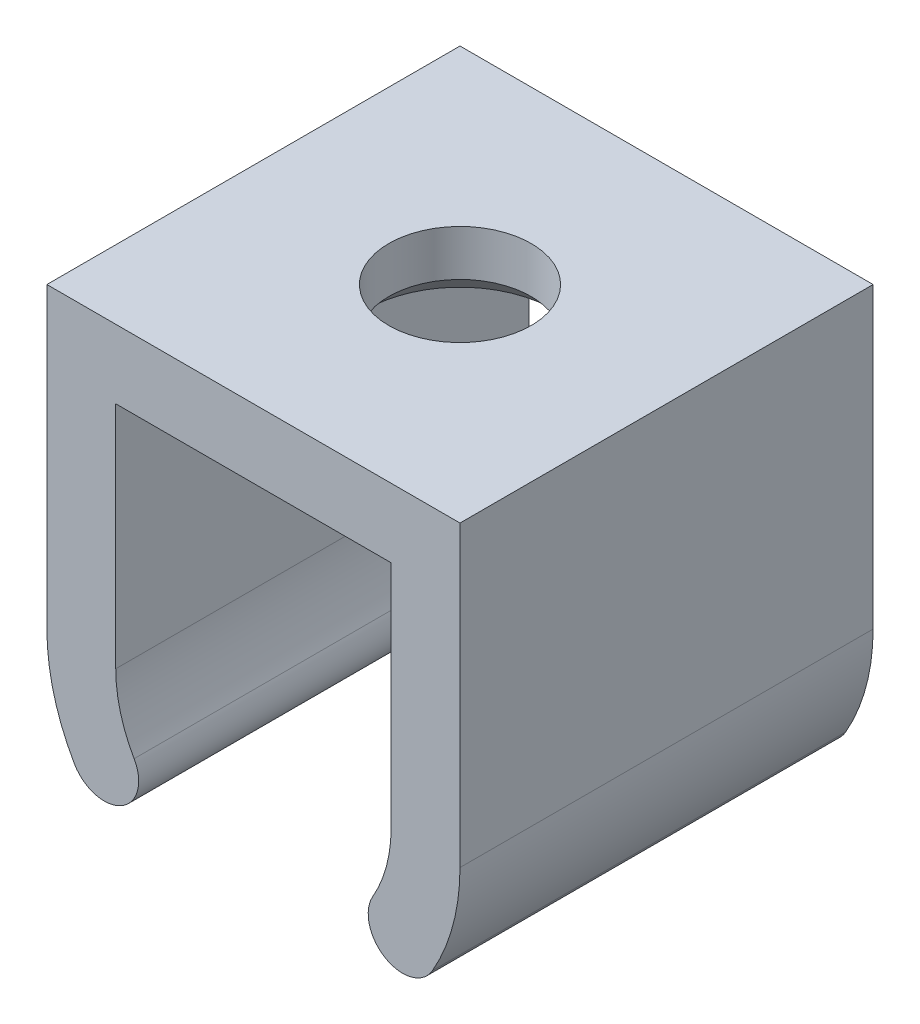
ISO-10303-21;
HEADER;
FILE_DESCRIPTION(('STEP AP214'),'2;1');
FILE_NAME('part.step','',(''),(''),'','','');
FILE_SCHEMA(('AUTOMOTIVE_DESIGN { 1 0 10303 214 1 1 1 1 }'));
ENDSEC;
DATA;
#1=APPLICATION_CONTEXT('core data for automotive mechanical design processes');
#2=APPLICATION_PROTOCOL_DEFINITION('international standard','automotive_design',2000,#1);
#3=PRODUCT_CONTEXT('',#1,'mechanical');
#4=PRODUCT('Part','Part','',(#3));
#5=PRODUCT_RELATED_PRODUCT_CATEGORY('part','',(#4));
#6=PRODUCT_DEFINITION_FORMATION('','',#4);
#7=PRODUCT_DEFINITION_CONTEXT('part definition',#1,'design');
#8=PRODUCT_DEFINITION('design','',#6,#7);
#9=PRODUCT_DEFINITION_SHAPE('','',#8);
#10=(LENGTH_UNIT() NAMED_UNIT(*) SI_UNIT(.MILLI.,.METRE.));
#11=(NAMED_UNIT(*) PLANE_ANGLE_UNIT() SI_UNIT($,.RADIAN.));
#12=(NAMED_UNIT(*) SI_UNIT($,.STERADIAN.) SOLID_ANGLE_UNIT());
#13=UNCERTAINTY_MEASURE_WITH_UNIT(LENGTH_MEASURE(1.E-05),#10,'distance_accuracy_value','');
#14=(GEOMETRIC_REPRESENTATION_CONTEXT(3) GLOBAL_UNCERTAINTY_ASSIGNED_CONTEXT((#13)) GLOBAL_UNIT_ASSIGNED_CONTEXT((#10,
#11,#12)) REPRESENTATION_CONTEXT('',''));
#15=CARTESIAN_POINT('',(0.,0.,0.));
#16=DIRECTION('',(0.,0.,1.));
#17=DIRECTION('',(1.,0.,0.));
#18=AXIS2_PLACEMENT_3D('',#15,#16,#17);
#19=CARTESIAN_POINT('',(0.,0.,4.5));
#20=DIRECTION('',(0.,0.,-1.));
#21=DIRECTION('',(-1.,0.,0.));
#22=AXIS2_PLACEMENT_3D('',#19,#20,#21);
#23=CYLINDRICAL_SURFACE('',#22,3.);
#24=DIRECTION('',(0.,0.,1.));
#25=VECTOR('',#24,1.);
#26=CARTESIAN_POINT('',(3.,0.,-4.5));
#27=LINE('',#26,#25);
#28=CARTESIAN_POINT('',(3.,0.,-4.5));
#29=VERTEX_POINT('',#28);
#30=CARTESIAN_POINT('',(3.,0.,4.500006));
#31=VERTEX_POINT('',#30);
#32=EDGE_CURVE('E209',#29,#31,#27,.T.);
#33=ORIENTED_EDGE('',*,*,#32,.F.);
#34=CARTESIAN_POINT('',(0.,0.,-4.5));
#35=DIRECTION('',(0.,0.,-1.));
#36=DIRECTION('',(1.,0.,0.));
#37=AXIS2_PLACEMENT_3D('',#34,#35,#36);
#38=CIRCLE('',#37,3.);
#39=CARTESIAN_POINT('',(2.6,-1.49666295470958,-4.5));
#40=VERTEX_POINT('',#39);
#41=EDGE_CURVE('E152',#29,#40,#38,.T.);
#42=ORIENTED_EDGE('',*,*,#41,.T.);
#43=DIRECTION('',(0.,0.,-1.));
#44=VECTOR('',#43,1.);
#45=CARTESIAN_POINT('',(2.6,-1.49666295470958,4.5));
#46=LINE('',#45,#44);
#47=CARTESIAN_POINT('',(2.6,-1.49666295470958,4.5));
#48=VERTEX_POINT('',#47);
#49=EDGE_CURVE('E166',#48,#40,#46,.T.);
#50=ORIENTED_EDGE('',*,*,#49,.F.);
#51=CARTESIAN_POINT('',(0.,0.,4.5));
#52=DIRECTION('',(0.,0.,-1.));
#53=DIRECTION('',(1.,0.,0.));
#54=AXIS2_PLACEMENT_3D('',#51,#52,#53);
#55=CIRCLE('',#54,3.);
#56=EDGE_CURVE('E180',#31,#48,#55,.T.);
#57=ORIENTED_EDGE('',*,*,#56,.F.);
#58=EDGE_LOOP('',(#33,#42,#50,#57));
#59=FACE_BOUND('',#58,.T.);
#60=ADVANCED_FACE('F33',(#59),#23,.F.);
#61=CARTESIAN_POINT('',(-4.5,0.,4.5));
#62=DIRECTION('',(1.,0.,0.));
#63=DIRECTION('',(0.,0.,-1.));
#64=AXIS2_PLACEMENT_3D('',#61,#62,#63);
#65=PLANE('',#64);
#66=DIRECTION('',(0.,-1.,0.));
#67=VECTOR('',#66,1.);
#68=CARTESIAN_POINT('',(-4.5,0.,-4.5));
#69=LINE('',#68,#67);
#70=CARTESIAN_POINT('',(-4.5,6.5,-4.5));
#71=VERTEX_POINT('',#70);
#72=CARTESIAN_POINT('',(-4.5,0.,-4.5));
#73=VERTEX_POINT('',#72);
#74=EDGE_CURVE('E144',#71,#73,#69,.T.);
#75=ORIENTED_EDGE('',*,*,#74,.T.);
#76=DIRECTION('',(0.,0.,-1.));
#77=VECTOR('',#76,1.);
#78=CARTESIAN_POINT('',(-4.5,0.,4.5));
#79=LINE('',#78,#77);
#80=CARTESIAN_POINT('',(-4.5,0.,4.5));
#81=VERTEX_POINT('',#80);
#82=EDGE_CURVE('E175',#81,#73,#79,.T.);
#83=ORIENTED_EDGE('',*,*,#82,.F.);
#84=DIRECTION('',(0.,-1.,0.));
#85=VECTOR('',#84,1.);
#86=CARTESIAN_POINT('',(-4.5,0.,4.5));
#87=LINE('',#86,#85);
#88=CARTESIAN_POINT('',(-4.5,6.5,4.5));
#89=VERTEX_POINT('',#88);
#90=EDGE_CURVE('E162',#89,#81,#87,.T.);
#91=ORIENTED_EDGE('',*,*,#90,.F.);
#92=DIRECTION('',(0.,0.,-1.));
#93=VECTOR('',#92,1.);
#94=CARTESIAN_POINT('',(-4.5,6.5,4.5));
#95=LINE('',#94,#93);
#96=EDGE_CURVE('E140',#89,#71,#95,.T.);
#97=ORIENTED_EDGE('',*,*,#96,.T.);
#98=EDGE_LOOP('',(#75,#83,#91,#97));
#99=FACE_BOUND('',#98,.T.);
#100=ADVANCED_FACE('F266',(#99),#65,.F.);
#101=CARTESIAN_POINT('',(0.,0.,4.5));
#102=DIRECTION('',(0.,0.,-1.));
#103=DIRECTION('',(-1.,0.,0.));
#104=AXIS2_PLACEMENT_3D('',#101,#102,#103);
#105=CYLINDRICAL_SURFACE('',#104,4.5);
#106=CARTESIAN_POINT('',(0.,0.,-4.5));
#107=DIRECTION('',(0.,0.,1.));
#108=DIRECTION('',(-1.,0.,0.));
#109=AXIS2_PLACEMENT_3D('',#106,#107,#108);
#110=CIRCLE('',#109,4.5);
#111=CARTESIAN_POINT('',(-3.9,-2.24499443206436,-4.5));
#112=VERTEX_POINT('',#111);
#113=EDGE_CURVE('E147',#73,#112,#110,.T.);
#114=ORIENTED_EDGE('',*,*,#113,.T.);
#115=DIRECTION('',(0.,0.,-1.));
#116=VECTOR('',#115,1.);
#117=CARTESIAN_POINT('',(-3.9,-2.24499443206436,4.5));
#118=LINE('',#117,#116);
#119=CARTESIAN_POINT('',(-3.9,-2.24499443206436,4.5));
#120=VERTEX_POINT('',#119);
#121=EDGE_CURVE('E172',#120,#112,#118,.T.);
#122=ORIENTED_EDGE('',*,*,#121,.F.);
#123=CARTESIAN_POINT('',(0.,0.,4.5));
#124=DIRECTION('',(0.,0.,1.));
#125=DIRECTION('',(-1.,0.,0.));
#126=AXIS2_PLACEMENT_3D('',#123,#124,#125);
#127=CIRCLE('',#126,4.5);
#128=EDGE_CURVE('E99',#81,#120,#127,.T.);
#129=ORIENTED_EDGE('',*,*,#128,.F.);
#130=ORIENTED_EDGE('',*,*,#82,.T.);
#131=EDGE_LOOP('',(#114,#122,#129,#130));
#132=FACE_BOUND('',#131,.T.);
#133=ADVANCED_FACE('F262',(#132),#105,.T.);
#134=CARTESIAN_POINT('',(-3.25,-1.87082869338697,4.5));
#135=DIRECTION('',(0.,0.,-1.));
#136=DIRECTION('',(-1.,0.,0.));
#137=AXIS2_PLACEMENT_3D('',#134,#135,#136);
#138=CYLINDRICAL_SURFACE('',#137,0.75);
#139=CARTESIAN_POINT('',(-3.25,-1.87082869338697,-4.5));
#140=DIRECTION('',(0.,0.,1.));
#141=DIRECTION('',(1.,0.,0.));
#142=AXIS2_PLACEMENT_3D('',#139,#140,#141);
#143=CIRCLE('',#142,0.75);
#144=CARTESIAN_POINT('',(-2.6,-1.49666295470958,-4.5));
#145=VERTEX_POINT('',#144);
#146=EDGE_CURVE('E150',#112,#145,#143,.T.);
#147=ORIENTED_EDGE('',*,*,#146,.T.);
#148=DIRECTION('',(0.,0.,-1.));
#149=VECTOR('',#148,1.);
#150=CARTESIAN_POINT('',(-2.6,-1.49666295470958,4.5));
#151=LINE('',#150,#149);
#152=CARTESIAN_POINT('',(-2.6,-1.49666295470958,4.5));
#153=VERTEX_POINT('',#152);
#154=EDGE_CURVE('E169',#153,#145,#151,.T.);
#155=ORIENTED_EDGE('',*,*,#154,.F.);
#156=CARTESIAN_POINT('',(-3.25,-1.87082869338697,4.5));
#157=DIRECTION('',(0.,0.,1.));
#158=DIRECTION('',(1.,0.,0.));
#159=AXIS2_PLACEMENT_3D('',#156,#157,#158);
#160=CIRCLE('',#159,0.75);
#161=EDGE_CURVE('E183',#120,#153,#160,.T.);
#162=ORIENTED_EDGE('',*,*,#161,.F.);
#163=ORIENTED_EDGE('',*,*,#121,.T.);
#164=EDGE_LOOP('',(#147,#155,#162,#163));
#165=FACE_BOUND('',#164,.T.);
#166=ADVANCED_FACE('F261',(#165),#138,.T.);
#167=CARTESIAN_POINT('',(-3.,0.,-4.5));
#168=VERTEX_POINT('',#167);
#169=EDGE_CURVE('E153',#145,#168,#38,.T.);
#170=ORIENTED_EDGE('',*,*,#169,.T.);
#171=DIRECTION('',(0.,0.,1.));
#172=VECTOR('',#171,1.);
#173=CARTESIAN_POINT('',(-3.,0.,-4.5));
#174=LINE('',#173,#172);
#175=CARTESIAN_POINT('',(-3.,0.,4.500006));
#176=VERTEX_POINT('',#175);
#177=EDGE_CURVE('E198',#168,#176,#174,.T.);
#178=ORIENTED_EDGE('',*,*,#177,.T.);
#179=EDGE_CURVE('E177',#153,#176,#55,.T.);
#180=ORIENTED_EDGE('',*,*,#179,.F.);
#181=ORIENTED_EDGE('',*,*,#154,.T.);
#182=EDGE_LOOP('',(#170,#178,#180,#181));
#183=FACE_BOUND('',#182,.T.);
#184=ADVANCED_FACE('F255',(#183),#23,.F.);
#185=CARTESIAN_POINT('',(3.25,-1.87082869338697,4.5));
#186=DIRECTION('',(0.,0.,-1.));
#187=DIRECTION('',(-1.,0.,0.));
#188=AXIS2_PLACEMENT_3D('',#185,#186,#187);
#189=CYLINDRICAL_SURFACE('',#188,0.75);
#190=CARTESIAN_POINT('',(3.25,-1.87082869338697,-4.5));
#191=DIRECTION('',(0.,0.,1.));
#192=DIRECTION('',(1.,0.,0.));
#193=AXIS2_PLACEMENT_3D('',#190,#191,#192);
#194=CIRCLE('',#193,0.75);
#195=CARTESIAN_POINT('',(3.9,-2.24499443206436,-4.5));
#196=VERTEX_POINT('',#195);
#197=EDGE_CURVE('E156',#40,#196,#194,.T.);
#198=ORIENTED_EDGE('',*,*,#197,.T.);
#199=DIRECTION('',(0.,0.,-1.));
#200=VECTOR('',#199,1.);
#201=CARTESIAN_POINT('',(3.9,-2.24499443206436,4.5));
#202=LINE('',#201,#200);
#203=CARTESIAN_POINT('',(3.9,-2.24499443206436,4.5));
#204=VERTEX_POINT('',#203);
#205=EDGE_CURVE('E135',#204,#196,#202,.T.);
#206=ORIENTED_EDGE('',*,*,#205,.F.);
#207=CARTESIAN_POINT('',(3.25,-1.87082869338697,4.5));
#208=DIRECTION('',(0.,0.,1.));
#209=DIRECTION('',(1.,0.,0.));
#210=AXIS2_PLACEMENT_3D('',#207,#208,#209);
#211=CIRCLE('',#210,0.75);
#212=EDGE_CURVE('E123',#48,#204,#211,.T.);
#213=ORIENTED_EDGE('',*,*,#212,.F.);
#214=ORIENTED_EDGE('',*,*,#49,.T.);
#215=EDGE_LOOP('',(#198,#206,#213,#214));
#216=FACE_BOUND('',#215,.T.);
#217=ADVANCED_FACE('F287',(#216),#189,.T.);
#218=CARTESIAN_POINT('',(0.,0.,4.5));
#219=DIRECTION('',(0.,0.,-1.));
#220=DIRECTION('',(-1.,0.,0.));
#221=AXIS2_PLACEMENT_3D('',#218,#219,#220);
#222=CYLINDRICAL_SURFACE('',#221,4.5);
#223=CARTESIAN_POINT('',(0.,0.,-4.5));
#224=DIRECTION('',(0.,0.,1.));
#225=DIRECTION('',(-1.,0.,0.));
#226=AXIS2_PLACEMENT_3D('',#223,#224,#225);
#227=CIRCLE('',#226,4.5);
#228=CARTESIAN_POINT('',(4.5,0.,-4.5));
#229=VERTEX_POINT('',#228);
#230=EDGE_CURVE('E132',#196,#229,#227,.T.);
#231=ORIENTED_EDGE('',*,*,#230,.T.);
#232=DIRECTION('',(0.,0.,-1.));
#233=VECTOR('',#232,1.);
#234=CARTESIAN_POINT('',(4.5,0.,4.5));
#235=LINE('',#234,#233);
#236=CARTESIAN_POINT('',(4.5,0.,4.5));
#237=VERTEX_POINT('',#236);
#238=EDGE_CURVE('E129',#237,#229,#235,.T.);
#239=ORIENTED_EDGE('',*,*,#238,.F.);
#240=CARTESIAN_POINT('',(0.,0.,4.5));
#241=DIRECTION('',(0.,0.,1.));
#242=DIRECTION('',(-1.,0.,0.));
#243=AXIS2_PLACEMENT_3D('',#240,#241,#242);
#244=CIRCLE('',#243,4.5);
#245=EDGE_CURVE('E115',#204,#237,#244,.T.);
#246=ORIENTED_EDGE('',*,*,#245,.F.);
#247=ORIENTED_EDGE('',*,*,#205,.T.);
#248=EDGE_LOOP('',(#231,#239,#246,#247));
#249=FACE_BOUND('',#248,.T.);
#250=ADVANCED_FACE('F130',(#249),#222,.T.);
#251=CARTESIAN_POINT('',(4.5,6.5,4.5));
#252=DIRECTION('',(-1.,0.,0.));
#253=DIRECTION('',(0.,0.,1.));
#254=AXIS2_PLACEMENT_3D('',#251,#252,#253);
#255=PLANE('',#254);
#256=DIRECTION('',(0.,1.,0.));
#257=VECTOR('',#256,1.);
#258=CARTESIAN_POINT('',(4.5,6.5,-4.5));
#259=LINE('',#258,#257);
#260=CARTESIAN_POINT('',(4.5,6.5,-4.5));
#261=VERTEX_POINT('',#260);
#262=EDGE_CURVE('E159',#229,#261,#259,.T.);
#263=ORIENTED_EDGE('',*,*,#262,.T.);
#264=DIRECTION('',(0.,0.,-1.));
#265=VECTOR('',#264,1.);
#266=CARTESIAN_POINT('',(4.5,6.5,4.5));
#267=LINE('',#266,#265);
#268=CARTESIAN_POINT('',(4.5,6.5,4.5));
#269=VERTEX_POINT('',#268);
#270=EDGE_CURVE('E136',#269,#261,#267,.T.);
#271=ORIENTED_EDGE('',*,*,#270,.F.);
#272=DIRECTION('',(0.,1.,0.));
#273=VECTOR('',#272,1.);
#274=CARTESIAN_POINT('',(4.5,6.5,4.5));
#275=LINE('',#274,#273);
#276=EDGE_CURVE('E120',#237,#269,#275,.T.);
#277=ORIENTED_EDGE('',*,*,#276,.F.);
#278=ORIENTED_EDGE('',*,*,#238,.T.);
#279=EDGE_LOOP('',(#263,#271,#277,#278));
#280=FACE_BOUND('',#279,.T.);
#281=ADVANCED_FACE('F138',(#280),#255,.F.);
#282=CARTESIAN_POINT('',(-4.5,6.5,4.5));
#283=DIRECTION('',(0.,-1.,0.));
#284=DIRECTION('',(0.,0.,-1.));
#285=AXIS2_PLACEMENT_3D('',#282,#283,#284);
#286=PLANE('',#285);
#287=CARTESIAN_POINT('',(0.,6.5,0.));
#288=DIRECTION('',(0.,1.,0.));
#289=DIRECTION('',(0.,0.,1.));
#290=AXIS2_PLACEMENT_3D('',#287,#288,#289);
#291=CIRCLE('',#290,1.55);
#292=CARTESIAN_POINT('',(0.,6.5,1.55));
#293=VERTEX_POINT('',#292);
#294=EDGE_CURVE('E148',#293,#293,#291,.T.);
#295=ORIENTED_EDGE('',*,*,#294,.F.);
#296=EDGE_LOOP('',(#295));
#297=FACE_BOUND('',#296,.T.);
#298=DIRECTION('',(-1.,0.,0.));
#299=VECTOR('',#298,1.);
#300=CARTESIAN_POINT('',(-4.5,6.5,-4.5));
#301=LINE('',#300,#299);
#302=EDGE_CURVE('E90',#261,#71,#301,.T.);
#303=ORIENTED_EDGE('',*,*,#302,.T.);
#304=ORIENTED_EDGE('',*,*,#96,.F.);
#305=DIRECTION('',(-1.,0.,0.));
#306=VECTOR('',#305,1.);
#307=CARTESIAN_POINT('',(-4.5,6.5,4.5));
#308=LINE('',#307,#306);
#309=EDGE_CURVE('E57',#269,#89,#308,.T.);
#310=ORIENTED_EDGE('',*,*,#309,.F.);
#311=ORIENTED_EDGE('',*,*,#270,.T.);
#312=EDGE_LOOP('',(#303,#304,#310,#311));
#313=FACE_BOUND('',#312,.T.);
#314=ADVANCED_FACE('F267',(#297,#313),#286,.F.);
#315=CARTESIAN_POINT('',(0.,0.,4.5));
#316=DIRECTION('',(0.,0.,-1.));
#317=DIRECTION('',(-1.,0.,0.));
#318=AXIS2_PLACEMENT_3D('',#315,#316,#317);
#319=PLANE('',#318);
#320=ORIENTED_EDGE('',*,*,#179,.T.);
#321=DIRECTION('',(0.,1.,0.));
#322=VECTOR('',#321,1.);
#323=CARTESIAN_POINT('',(-3.,0.,4.5));
#324=LINE('',#323,#322);
#325=CARTESIAN_POINT('',(-3.,5.,4.5));
#326=VERTEX_POINT('',#325);
#327=EDGE_CURVE('E190',#176,#326,#324,.T.);
#328=ORIENTED_EDGE('',*,*,#327,.T.);
#329=DIRECTION('',(1.,0.,0.));
#330=VECTOR('',#329,1.);
#331=CARTESIAN_POINT('',(0.,5.,4.5));
#332=LINE('',#331,#330);
#333=CARTESIAN_POINT('',(3.,5.,4.5));
#334=VERTEX_POINT('',#333);
#335=EDGE_CURVE('E201',#326,#334,#332,.T.);
#336=ORIENTED_EDGE('',*,*,#335,.T.);
#337=DIRECTION('',(0.,-1.,0.));
#338=VECTOR('',#337,1.);
#339=CARTESIAN_POINT('',(3.,0.,4.5));
#340=LINE('',#339,#338);
#341=EDGE_CURVE('E195',#334,#31,#340,.T.);
#342=ORIENTED_EDGE('',*,*,#341,.T.);
#343=ORIENTED_EDGE('',*,*,#56,.T.);
#344=ORIENTED_EDGE('',*,*,#212,.T.);
#345=ORIENTED_EDGE('',*,*,#245,.T.);
#346=ORIENTED_EDGE('',*,*,#276,.T.);
#347=ORIENTED_EDGE('',*,*,#309,.T.);
#348=ORIENTED_EDGE('',*,*,#90,.T.);
#349=ORIENTED_EDGE('',*,*,#128,.T.);
#350=ORIENTED_EDGE('',*,*,#161,.T.);
#351=EDGE_LOOP('',(#320,#328,#336,#342,#343,#344,#345,#346,#347,#348,#349,#350));
#352=FACE_BOUND('',#351,.T.);
#353=ADVANCED_FACE('F118',(#352),#319,.F.);
#354=CARTESIAN_POINT('',(0.,0.,-4.5));
#355=DIRECTION('',(0.,0.,-1.));
#356=DIRECTION('',(-1.,0.,0.));
#357=AXIS2_PLACEMENT_3D('',#354,#355,#356);
#358=PLANE('',#357);
#359=DIRECTION('',(0.,-1.,0.));
#360=VECTOR('',#359,1.);
#361=CARTESIAN_POINT('',(-3.,0.,-4.5));
#362=LINE('',#361,#360);
#363=CARTESIAN_POINT('',(-3.,5.,-4.5));
#364=VERTEX_POINT('',#363);
#365=EDGE_CURVE('E213',#364,#168,#362,.T.);
#366=ORIENTED_EDGE('',*,*,#365,.T.);
#367=ORIENTED_EDGE('',*,*,#169,.F.);
#368=ORIENTED_EDGE('',*,*,#146,.F.);
#369=ORIENTED_EDGE('',*,*,#113,.F.);
#370=ORIENTED_EDGE('',*,*,#74,.F.);
#371=ORIENTED_EDGE('',*,*,#302,.F.);
#372=ORIENTED_EDGE('',*,*,#262,.F.);
#373=ORIENTED_EDGE('',*,*,#230,.F.);
#374=ORIENTED_EDGE('',*,*,#197,.F.);
#375=ORIENTED_EDGE('',*,*,#41,.F.);
#376=DIRECTION('',(0.,1.,0.));
#377=VECTOR('',#376,1.);
#378=CARTESIAN_POINT('',(3.,5.,-4.5));
#379=LINE('',#378,#377);
#380=CARTESIAN_POINT('',(3.,5.,-4.5));
#381=VERTEX_POINT('',#380);
#382=EDGE_CURVE('E222',#29,#381,#379,.T.);
#383=ORIENTED_EDGE('',*,*,#382,.T.);
#384=DIRECTION('',(-1.,0.,0.));
#385=VECTOR('',#384,1.);
#386=CARTESIAN_POINT('',(-3.,5.,-4.5));
#387=LINE('',#386,#385);
#388=EDGE_CURVE('E48',#381,#364,#387,.T.);
#389=ORIENTED_EDGE('',*,*,#388,.T.);
#390=EDGE_LOOP('',(#366,#367,#368,#369,#370,#371,#372,#373,#374,#375,#383,#389));
#391=FACE_BOUND('',#390,.T.);
#392=ADVANCED_FACE('F227',(#391),#358,.T.);
#393=CARTESIAN_POINT('',(0.,-2.62182869338697,0.));
#394=DIRECTION('',(0.,1.,0.));
#395=DIRECTION('',(0.,0.,1.));
#396=AXIS2_PLACEMENT_3D('',#393,#394,#395);
#397=CYLINDRICAL_SURFACE('',#396,1.55);
#398=CARTESIAN_POINT('',(0.,5.5,0.));
#399=DIRECTION('',(0.,1.,0.));
#400=DIRECTION('',(0.,0.,1.));
#401=AXIS2_PLACEMENT_3D('',#398,#399,#400);
#402=CIRCLE('',#401,1.55);
#403=CARTESIAN_POINT('',(0.,5.5,1.55));
#404=VERTEX_POINT('',#403);
#405=EDGE_CURVE('E41',#404,#404,#402,.F.);
#406=ORIENTED_EDGE('',*,*,#405,.T.);
#407=EDGE_LOOP('',(#406));
#408=FACE_BOUND('',#407,.T.);
#409=ORIENTED_EDGE('',*,*,#294,.T.);
#410=EDGE_LOOP('',(#409));
#411=FACE_BOUND('',#410,.T.);
#412=ADVANCED_FACE('F349',(#408,#411),#397,.F.);
#413=CARTESIAN_POINT('',(-3.,0.,-4.5));
#414=DIRECTION('',(-1.,0.,0.));
#415=DIRECTION('',(0.,0.,1.));
#416=AXIS2_PLACEMENT_3D('',#413,#414,#415);
#417=PLANE('',#416);
#418=ORIENTED_EDGE('',*,*,#177,.F.);
#419=ORIENTED_EDGE('',*,*,#365,.F.);
#420=DIRECTION('',(0.,0.,1.));
#421=VECTOR('',#420,1.);
#422=CARTESIAN_POINT('',(-3.,5.,-4.5));
#423=LINE('',#422,#421);
#424=EDGE_CURVE('E202',#364,#326,#423,.T.);
#425=ORIENTED_EDGE('',*,*,#424,.T.);
#426=ORIENTED_EDGE('',*,*,#327,.F.);
#427=EDGE_LOOP('',(#418,#419,#425,#426));
#428=FACE_BOUND('',#427,.T.);
#429=ADVANCED_FACE('F250',(#428),#417,.F.);
#430=CARTESIAN_POINT('',(3.,5.,-4.5));
#431=DIRECTION('',(1.,0.,0.));
#432=DIRECTION('',(0.,0.,-1.));
#433=AXIS2_PLACEMENT_3D('',#430,#431,#432);
#434=PLANE('',#433);
#435=DIRECTION('',(0.,0.,1.));
#436=VECTOR('',#435,1.);
#437=CARTESIAN_POINT('',(3.,5.,-4.5));
#438=LINE('',#437,#436);
#439=EDGE_CURVE('E212',#381,#334,#438,.T.);
#440=ORIENTED_EDGE('',*,*,#439,.F.);
#441=ORIENTED_EDGE('',*,*,#382,.F.);
#442=ORIENTED_EDGE('',*,*,#32,.T.);
#443=ORIENTED_EDGE('',*,*,#341,.F.);
#444=EDGE_LOOP('',(#440,#441,#442,#443));
#445=FACE_BOUND('',#444,.T.);
#446=ADVANCED_FACE('F233',(#445),#434,.F.);
#447=CARTESIAN_POINT('',(-3.,5.,-4.5));
#448=DIRECTION('',(0.,1.,0.));
#449=DIRECTION('',(0.,0.,1.));
#450=AXIS2_PLACEMENT_3D('',#447,#448,#449);
#451=PLANE('',#450);
#452=CARTESIAN_POINT('',(0.,5.,0.));
#453=DIRECTION('',(0.,1.,0.));
#454=DIRECTION('',(0.,0.,1.));
#455=AXIS2_PLACEMENT_3D('',#452,#453,#454);
#456=CIRCLE('',#455,2.05);
#457=CARTESIAN_POINT('',(0.,5.,2.05));
#458=VERTEX_POINT('',#457);
#459=EDGE_CURVE('E11',#458,#458,#456,.T.);
#460=ORIENTED_EDGE('',*,*,#459,.T.);
#461=EDGE_LOOP('',(#460));
#462=FACE_BOUND('',#461,.T.);
#463=ORIENTED_EDGE('',*,*,#424,.F.);
#464=ORIENTED_EDGE('',*,*,#388,.F.);
#465=ORIENTED_EDGE('',*,*,#439,.T.);
#466=ORIENTED_EDGE('',*,*,#335,.F.);
#467=EDGE_LOOP('',(#463,#464,#465,#466));
#468=FACE_BOUND('',#467,.T.);
#469=ADVANCED_FACE('F243',(#462,#468),#451,.F.);
#470=CARTESIAN_POINT('',(0.,5.5,0.));
#471=DIRECTION('',(0.,-1.,0.));
#472=DIRECTION('',(0.,0.,-1.));
#473=AXIS2_PLACEMENT_3D('',#470,#471,#472);
#474=CONICAL_SURFACE('',#473,1.55,0.785398163397449);
#475=ORIENTED_EDGE('',*,*,#459,.F.);
#476=EDGE_LOOP('',(#475));
#477=FACE_BOUND('',#476,.T.);
#478=ORIENTED_EDGE('',*,*,#405,.F.);
#479=EDGE_LOOP('',(#478));
#480=FACE_BOUND('',#479,.T.);
#481=ADVANCED_FACE('F35',(#477,#480),#474,.F.);
#482=CLOSED_SHELL('',(#60,#100,#133,#166,#184,#217,#250,#281,#314,#353,#392,#412,#429,#446,#469,#481));
#483=MANIFOLD_SOLID_BREP('B2',#482);
#484=ADVANCED_BREP_SHAPE_REPRESENTATION('',(#18,#483),#14);
#485=SHAPE_DEFINITION_REPRESENTATION(#9,#484);
ENDSEC;
END-ISO-10303-21;
